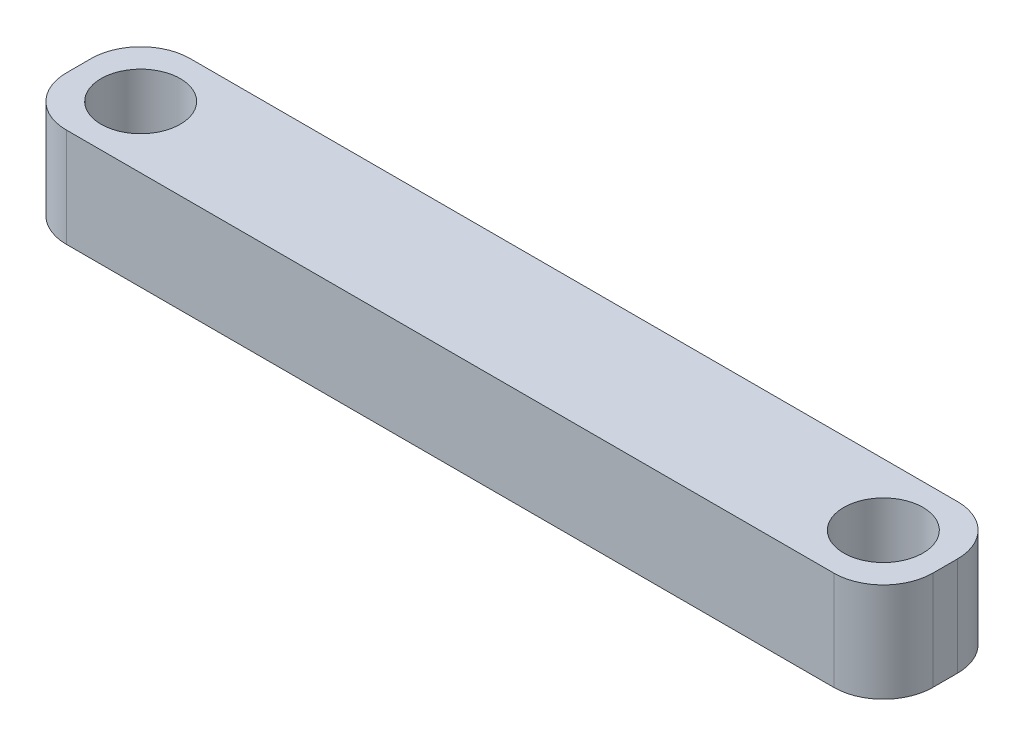
ISO-10303-21;
HEADER;
FILE_DESCRIPTION(('STEP AP214'),'2;1');
FILE_NAME('part.step','',(''),(''),'','','');
FILE_SCHEMA(('AUTOMOTIVE_DESIGN { 1 0 10303 214 1 1 1 1 }'));
ENDSEC;
DATA;
#1=APPLICATION_CONTEXT('core data for automotive mechanical design processes');
#2=APPLICATION_PROTOCOL_DEFINITION('international standard','automotive_design',2000,#1);
#3=PRODUCT_CONTEXT('',#1,'mechanical');
#4=PRODUCT('Part','Part','',(#3));
#5=PRODUCT_RELATED_PRODUCT_CATEGORY('part','',(#4));
#6=PRODUCT_DEFINITION_FORMATION('','',#4);
#7=PRODUCT_DEFINITION_CONTEXT('part definition',#1,'design');
#8=PRODUCT_DEFINITION('design','',#6,#7);
#9=PRODUCT_DEFINITION_SHAPE('','',#8);
#10=(LENGTH_UNIT() NAMED_UNIT(*) SI_UNIT(.MILLI.,.METRE.));
#11=(NAMED_UNIT(*) PLANE_ANGLE_UNIT() SI_UNIT($,.RADIAN.));
#12=(NAMED_UNIT(*) SI_UNIT($,.STERADIAN.) SOLID_ANGLE_UNIT());
#13=UNCERTAINTY_MEASURE_WITH_UNIT(LENGTH_MEASURE(1.E-05),#10,'distance_accuracy_value','');
#14=(GEOMETRIC_REPRESENTATION_CONTEXT(3) GLOBAL_UNCERTAINTY_ASSIGNED_CONTEXT((#13)) GLOBAL_UNIT_ASSIGNED_CONTEXT((#10,
#11,#12)) REPRESENTATION_CONTEXT('',''));
#15=CARTESIAN_POINT('',(0.,0.,0.));
#16=DIRECTION('',(0.,0.,1.));
#17=DIRECTION('',(1.,0.,0.));
#18=AXIS2_PLACEMENT_3D('',#15,#16,#17);
#19=CARTESIAN_POINT('',(0.,4.,0.));
#20=DIRECTION('',(0.,1.,0.));
#21=DIRECTION('',(0.,0.,1.));
#22=AXIS2_PLACEMENT_3D('',#19,#20,#21);
#23=PLANE('',#22);
#24=CARTESIAN_POINT('',(-15.,4.,0.));
#25=DIRECTION('',(0.,1.,0.));
#26=DIRECTION('',(0.,0.,1.));
#27=AXIS2_PLACEMENT_3D('',#24,#25,#26);
#28=CIRCLE('',#27,1.6);
#29=CARTESIAN_POINT('',(-15.,4.,1.6));
#30=VERTEX_POINT('',#29);
#31=EDGE_CURVE('E133',#30,#30,#28,.T.);
#32=ORIENTED_EDGE('',*,*,#31,.F.);
#33=EDGE_LOOP('',(#32));
#34=FACE_BOUND('',#33,.T.);
#35=DIRECTION('',(1.,0.,0.));
#36=VECTOR('',#35,1.);
#37=CARTESIAN_POINT('',(-17.5,4.,2.5));
#38=LINE('',#37,#36);
#39=CARTESIAN_POINT('',(-15.5,4.,2.5));
#40=VERTEX_POINT('',#39);
#41=CARTESIAN_POINT('',(15.5,4.,2.5));
#42=VERTEX_POINT('',#41);
#43=EDGE_CURVE('E142',#40,#42,#38,.T.);
#44=ORIENTED_EDGE('',*,*,#43,.T.);
#45=CARTESIAN_POINT('',(15.5,4.,0.5));
#46=DIRECTION('',(0.,1.,0.));
#47=DIRECTION('',(0.,0.,1.));
#48=AXIS2_PLACEMENT_3D('',#45,#46,#47);
#49=CIRCLE('',#48,2.);
#50=CARTESIAN_POINT('',(17.5,4.,0.5));
#51=VERTEX_POINT('',#50);
#52=EDGE_CURVE('E161',#42,#51,#49,.T.);
#53=ORIENTED_EDGE('',*,*,#52,.T.);
#54=DIRECTION('',(0.,0.,-1.));
#55=VECTOR('',#54,1.);
#56=CARTESIAN_POINT('',(17.5,4.,-2.5));
#57=LINE('',#56,#55);
#58=CARTESIAN_POINT('',(17.5,4.,-0.5));
#59=VERTEX_POINT('',#58);
#60=EDGE_CURVE('E125',#51,#59,#57,.T.);
#61=ORIENTED_EDGE('',*,*,#60,.T.);
#62=CARTESIAN_POINT('',(15.5,4.,-0.5));
#63=DIRECTION('',(0.,1.,0.));
#64=DIRECTION('',(0.,0.,1.));
#65=AXIS2_PLACEMENT_3D('',#62,#63,#64);
#66=CIRCLE('',#65,2.);
#67=CARTESIAN_POINT('',(15.5,4.,-2.5));
#68=VERTEX_POINT('',#67);
#69=EDGE_CURVE('E159',#59,#68,#66,.T.);
#70=ORIENTED_EDGE('',*,*,#69,.T.);
#71=DIRECTION('',(-1.,0.,0.));
#72=VECTOR('',#71,1.);
#73=CARTESIAN_POINT('',(-17.5,4.,-2.5));
#74=LINE('',#73,#72);
#75=CARTESIAN_POINT('',(-15.5,4.,-2.5));
#76=VERTEX_POINT('',#75);
#77=EDGE_CURVE('E172',#68,#76,#74,.T.);
#78=ORIENTED_EDGE('',*,*,#77,.T.);
#79=CARTESIAN_POINT('',(-15.5,4.,-0.5));
#80=DIRECTION('',(0.,1.,0.));
#81=DIRECTION('',(0.,0.,1.));
#82=AXIS2_PLACEMENT_3D('',#79,#80,#81);
#83=CIRCLE('',#82,2.);
#84=CARTESIAN_POINT('',(-17.5,4.,-0.5));
#85=VERTEX_POINT('',#84);
#86=EDGE_CURVE('E60',#76,#85,#83,.T.);
#87=ORIENTED_EDGE('',*,*,#86,.T.);
#88=DIRECTION('',(0.,0.,1.));
#89=VECTOR('',#88,1.);
#90=CARTESIAN_POINT('',(-17.5,4.,-2.5));
#91=LINE('',#90,#89);
#92=CARTESIAN_POINT('',(-17.5,4.,0.5));
#93=VERTEX_POINT('',#92);
#94=EDGE_CURVE('E180',#85,#93,#91,.T.);
#95=ORIENTED_EDGE('',*,*,#94,.T.);
#96=CARTESIAN_POINT('',(-15.5,4.,0.5));
#97=DIRECTION('',(0.,1.,0.));
#98=DIRECTION('',(0.,0.,1.));
#99=AXIS2_PLACEMENT_3D('',#96,#97,#98);
#100=CIRCLE('',#99,2.);
#101=EDGE_CURVE('E156',#93,#40,#100,.T.);
#102=ORIENTED_EDGE('',*,*,#101,.T.);
#103=EDGE_LOOP('',(#44,#53,#61,#70,#78,#87,#95,#102));
#104=FACE_BOUND('',#103,.T.);
#105=CARTESIAN_POINT('',(15.,4.,0.));
#106=DIRECTION('',(0.,1.,0.));
#107=DIRECTION('',(0.,0.,-1.));
#108=AXIS2_PLACEMENT_3D('',#105,#106,#107);
#109=CIRCLE('',#108,1.6);
#110=CARTESIAN_POINT('',(15.,4.,-1.6));
#111=VERTEX_POINT('',#110);
#112=EDGE_CURVE('E187',#111,#111,#109,.T.);
#113=ORIENTED_EDGE('',*,*,#112,.F.);
#114=EDGE_LOOP('',(#113));
#115=FACE_BOUND('',#114,.T.);
#116=ADVANCED_FACE('F39',(#34,#104,#115),#23,.T.);
#117=CARTESIAN_POINT('',(0.,0.,0.));
#118=DIRECTION('',(0.,1.,0.));
#119=DIRECTION('',(0.,0.,1.));
#120=AXIS2_PLACEMENT_3D('',#117,#118,#119);
#121=PLANE('',#120);
#122=DIRECTION('',(0.,0.,-1.));
#123=VECTOR('',#122,1.);
#124=CARTESIAN_POINT('',(17.5,0.,-2.5));
#125=LINE('',#124,#123);
#126=CARTESIAN_POINT('',(17.5,0.,0.5));
#127=VERTEX_POINT('',#126);
#128=CARTESIAN_POINT('',(17.5,0.,-0.5));
#129=VERTEX_POINT('',#128);
#130=EDGE_CURVE('E122',#127,#129,#125,.T.);
#131=ORIENTED_EDGE('',*,*,#130,.F.);
#132=CARTESIAN_POINT('',(15.5,0.,0.5));
#133=DIRECTION('',(0.,1.,0.));
#134=DIRECTION('',(0.,0.,1.));
#135=AXIS2_PLACEMENT_3D('',#132,#133,#134);
#136=CIRCLE('',#135,2.);
#137=CARTESIAN_POINT('',(15.5,0.,2.5));
#138=VERTEX_POINT('',#137);
#139=EDGE_CURVE('E105',#127,#138,#136,.F.);
#140=ORIENTED_EDGE('',*,*,#139,.T.);
#141=DIRECTION('',(1.,0.,0.));
#142=VECTOR('',#141,1.);
#143=CARTESIAN_POINT('',(-17.5,0.,2.5));
#144=LINE('',#143,#142);
#145=CARTESIAN_POINT('',(-15.5,0.,2.5));
#146=VERTEX_POINT('',#145);
#147=EDGE_CURVE('E146',#146,#138,#144,.T.);
#148=ORIENTED_EDGE('',*,*,#147,.F.);
#149=CARTESIAN_POINT('',(-15.5,0.,0.5));
#150=DIRECTION('',(0.,1.,0.));
#151=DIRECTION('',(0.,0.,1.));
#152=AXIS2_PLACEMENT_3D('',#149,#150,#151);
#153=CIRCLE('',#152,2.);
#154=CARTESIAN_POINT('',(-17.5,0.,0.5));
#155=VERTEX_POINT('',#154);
#156=EDGE_CURVE('E126',#146,#155,#153,.F.);
#157=ORIENTED_EDGE('',*,*,#156,.T.);
#158=DIRECTION('',(0.,0.,1.));
#159=VECTOR('',#158,1.);
#160=CARTESIAN_POINT('',(-17.5,0.,-2.5));
#161=LINE('',#160,#159);
#162=CARTESIAN_POINT('',(-17.5,0.,-0.5));
#163=VERTEX_POINT('',#162);
#164=EDGE_CURVE('E136',#163,#155,#161,.T.);
#165=ORIENTED_EDGE('',*,*,#164,.F.);
#166=CARTESIAN_POINT('',(-15.5,0.,-0.5));
#167=DIRECTION('',(0.,1.,0.));
#168=DIRECTION('',(0.,0.,1.));
#169=AXIS2_PLACEMENT_3D('',#166,#167,#168);
#170=CIRCLE('',#169,2.);
#171=CARTESIAN_POINT('',(-15.5,0.,-2.5));
#172=VERTEX_POINT('',#171);
#173=EDGE_CURVE('E150',#163,#172,#170,.F.);
#174=ORIENTED_EDGE('',*,*,#173,.T.);
#175=DIRECTION('',(-1.,0.,0.));
#176=VECTOR('',#175,1.);
#177=CARTESIAN_POINT('',(-17.5,0.,-2.5));
#178=LINE('',#177,#176);
#179=CARTESIAN_POINT('',(15.5,0.,-2.5));
#180=VERTEX_POINT('',#179);
#181=EDGE_CURVE('E132',#180,#172,#178,.T.);
#182=ORIENTED_EDGE('',*,*,#181,.F.);
#183=CARTESIAN_POINT('',(15.5,0.,-0.5));
#184=DIRECTION('',(0.,1.,0.));
#185=DIRECTION('',(0.,0.,1.));
#186=AXIS2_PLACEMENT_3D('',#183,#184,#185);
#187=CIRCLE('',#186,2.);
#188=EDGE_CURVE('E116',#180,#129,#187,.F.);
#189=ORIENTED_EDGE('',*,*,#188,.T.);
#190=EDGE_LOOP('',(#131,#140,#148,#157,#165,#174,#182,#189));
#191=FACE_BOUND('',#190,.T.);
#192=CARTESIAN_POINT('',(-15.,0.,0.));
#193=DIRECTION('',(0.,1.,0.));
#194=DIRECTION('',(0.,0.,1.));
#195=AXIS2_PLACEMENT_3D('',#192,#193,#194);
#196=CIRCLE('',#195,1.6);
#197=CARTESIAN_POINT('',(-15.,0.,1.6));
#198=VERTEX_POINT('',#197);
#199=EDGE_CURVE('E139',#198,#198,#196,.T.);
#200=ORIENTED_EDGE('',*,*,#199,.T.);
#201=EDGE_LOOP('',(#200));
#202=FACE_BOUND('',#201,.T.);
#203=CARTESIAN_POINT('',(15.,0.,0.));
#204=DIRECTION('',(0.,1.,0.));
#205=DIRECTION('',(0.,0.,-1.));
#206=AXIS2_PLACEMENT_3D('',#203,#204,#205);
#207=CIRCLE('',#206,1.6);
#208=CARTESIAN_POINT('',(15.,0.,-1.6));
#209=VERTEX_POINT('',#208);
#210=EDGE_CURVE('E189',#209,#209,#207,.T.);
#211=ORIENTED_EDGE('',*,*,#210,.T.);
#212=EDGE_LOOP('',(#211));
#213=FACE_BOUND('',#212,.T.);
#214=ADVANCED_FACE('F129',(#191,#202,#213),#121,.F.);
#215=CARTESIAN_POINT('',(17.5,4.,-2.5));
#216=DIRECTION('',(-1.,0.,0.));
#217=DIRECTION('',(0.,0.,1.));
#218=AXIS2_PLACEMENT_3D('',#215,#216,#217);
#219=PLANE('',#218);
#220=ORIENTED_EDGE('',*,*,#60,.F.);
#221=DIRECTION('',(0.,-1.,0.));
#222=VECTOR('',#221,1.);
#223=CARTESIAN_POINT('',(17.5,4.,0.5));
#224=LINE('',#223,#222);
#225=EDGE_CURVE('E109',#51,#127,#224,.T.);
#226=ORIENTED_EDGE('',*,*,#225,.T.);
#227=ORIENTED_EDGE('',*,*,#130,.T.);
#228=DIRECTION('',(0.,-1.,0.));
#229=VECTOR('',#228,1.);
#230=CARTESIAN_POINT('',(17.5,4.,-0.5));
#231=LINE('',#230,#229);
#232=EDGE_CURVE('E127',#129,#59,#231,.F.);
#233=ORIENTED_EDGE('',*,*,#232,.T.);
#234=EDGE_LOOP('',(#220,#226,#227,#233));
#235=FACE_BOUND('',#234,.T.);
#236=ADVANCED_FACE('F121',(#235),#219,.F.);
#237=CARTESIAN_POINT('',(-17.5,4.,-2.5));
#238=DIRECTION('',(0.,0.,1.));
#239=DIRECTION('',(1.,0.,0.));
#240=AXIS2_PLACEMENT_3D('',#237,#238,#239);
#241=PLANE('',#240);
#242=ORIENTED_EDGE('',*,*,#77,.F.);
#243=DIRECTION('',(0.,-1.,0.));
#244=VECTOR('',#243,1.);
#245=CARTESIAN_POINT('',(15.5,4.,-2.5));
#246=LINE('',#245,#244);
#247=EDGE_CURVE('E165',#68,#180,#246,.T.);
#248=ORIENTED_EDGE('',*,*,#247,.T.);
#249=ORIENTED_EDGE('',*,*,#181,.T.);
#250=DIRECTION('',(0.,-1.,0.));
#251=VECTOR('',#250,1.);
#252=CARTESIAN_POINT('',(-15.5,4.,-2.5));
#253=LINE('',#252,#251);
#254=EDGE_CURVE('E163',#172,#76,#253,.F.);
#255=ORIENTED_EDGE('',*,*,#254,.T.);
#256=EDGE_LOOP('',(#242,#248,#249,#255));
#257=FACE_BOUND('',#256,.T.);
#258=ADVANCED_FACE('F170',(#257),#241,.F.);
#259=CARTESIAN_POINT('',(-17.5,4.,-2.5));
#260=DIRECTION('',(1.,0.,0.));
#261=DIRECTION('',(0.,0.,-1.));
#262=AXIS2_PLACEMENT_3D('',#259,#260,#261);
#263=PLANE('',#262);
#264=ORIENTED_EDGE('',*,*,#94,.F.);
#265=DIRECTION('',(0.,-1.,0.));
#266=VECTOR('',#265,1.);
#267=CARTESIAN_POINT('',(-17.5,4.,-0.5));
#268=LINE('',#267,#266);
#269=EDGE_CURVE('E11',#85,#163,#268,.T.);
#270=ORIENTED_EDGE('',*,*,#269,.T.);
#271=ORIENTED_EDGE('',*,*,#164,.T.);
#272=DIRECTION('',(0.,-1.,0.));
#273=VECTOR('',#272,1.);
#274=CARTESIAN_POINT('',(-17.5,4.,0.5));
#275=LINE('',#274,#273);
#276=EDGE_CURVE('E47',#155,#93,#275,.F.);
#277=ORIENTED_EDGE('',*,*,#276,.T.);
#278=EDGE_LOOP('',(#264,#270,#271,#277));
#279=FACE_BOUND('',#278,.T.);
#280=ADVANCED_FACE('F179',(#279),#263,.F.);
#281=CARTESIAN_POINT('',(-17.5,4.,2.5));
#282=DIRECTION('',(0.,0.,-1.));
#283=DIRECTION('',(-1.,0.,0.));
#284=AXIS2_PLACEMENT_3D('',#281,#282,#283);
#285=PLANE('',#284);
#286=ORIENTED_EDGE('',*,*,#147,.T.);
#287=DIRECTION('',(0.,-1.,0.));
#288=VECTOR('',#287,1.);
#289=CARTESIAN_POINT('',(15.5,4.,2.5));
#290=LINE('',#289,#288);
#291=EDGE_CURVE('E110',#138,#42,#290,.F.);
#292=ORIENTED_EDGE('',*,*,#291,.T.);
#293=ORIENTED_EDGE('',*,*,#43,.F.);
#294=DIRECTION('',(0.,-1.,0.));
#295=VECTOR('',#294,1.);
#296=CARTESIAN_POINT('',(-15.5,4.,2.5));
#297=LINE('',#296,#295);
#298=EDGE_CURVE('E115',#40,#146,#297,.T.);
#299=ORIENTED_EDGE('',*,*,#298,.T.);
#300=EDGE_LOOP('',(#286,#292,#293,#299));
#301=FACE_BOUND('',#300,.T.);
#302=ADVANCED_FACE('F211',(#301),#285,.F.);
#303=CARTESIAN_POINT('',(-15.,4.,0.));
#304=DIRECTION('',(0.,-1.,0.));
#305=DIRECTION('',(0.,0.,-1.));
#306=AXIS2_PLACEMENT_3D('',#303,#304,#305);
#307=CYLINDRICAL_SURFACE('',#306,1.6);
#308=ORIENTED_EDGE('',*,*,#31,.T.);
#309=EDGE_LOOP('',(#308));
#310=FACE_BOUND('',#309,.T.);
#311=ORIENTED_EDGE('',*,*,#199,.F.);
#312=EDGE_LOOP('',(#311));
#313=FACE_BOUND('',#312,.T.);
#314=ADVANCED_FACE('F208',(#310,#313),#307,.F.);
#315=CARTESIAN_POINT('',(15.,4.,0.));
#316=DIRECTION('',(0.,-1.,0.));
#317=DIRECTION('',(0.,0.,-1.));
#318=AXIS2_PLACEMENT_3D('',#315,#316,#317);
#319=CYLINDRICAL_SURFACE('',#318,1.6);
#320=ORIENTED_EDGE('',*,*,#112,.T.);
#321=EDGE_LOOP('',(#320));
#322=FACE_BOUND('',#321,.T.);
#323=ORIENTED_EDGE('',*,*,#210,.F.);
#324=EDGE_LOOP('',(#323));
#325=FACE_BOUND('',#324,.T.);
#326=ADVANCED_FACE('F195',(#322,#325),#319,.F.);
#327=CARTESIAN_POINT('',(15.5,4.,0.5));
#328=DIRECTION('',(0.,-1.,0.));
#329=DIRECTION('',(0.,0.,-1.));
#330=AXIS2_PLACEMENT_3D('',#327,#328,#329);
#331=CYLINDRICAL_SURFACE('',#330,2.);
#332=ORIENTED_EDGE('',*,*,#52,.F.);
#333=ORIENTED_EDGE('',*,*,#291,.F.);
#334=ORIENTED_EDGE('',*,*,#139,.F.);
#335=ORIENTED_EDGE('',*,*,#225,.F.);
#336=EDGE_LOOP('',(#332,#333,#334,#335));
#337=FACE_BOUND('',#336,.T.);
#338=ADVANCED_FACE('F108',(#337),#331,.T.);
#339=CARTESIAN_POINT('',(15.5,4.,-0.5));
#340=DIRECTION('',(0.,-1.,0.));
#341=DIRECTION('',(0.,0.,-1.));
#342=AXIS2_PLACEMENT_3D('',#339,#340,#341);
#343=CYLINDRICAL_SURFACE('',#342,2.);
#344=ORIENTED_EDGE('',*,*,#69,.F.);
#345=ORIENTED_EDGE('',*,*,#232,.F.);
#346=ORIENTED_EDGE('',*,*,#188,.F.);
#347=ORIENTED_EDGE('',*,*,#247,.F.);
#348=EDGE_LOOP('',(#344,#345,#346,#347));
#349=FACE_BOUND('',#348,.T.);
#350=ADVANCED_FACE('F223',(#349),#343,.T.);
#351=CARTESIAN_POINT('',(-15.5,4.,-0.5));
#352=DIRECTION('',(0.,-1.,0.));
#353=DIRECTION('',(0.,0.,-1.));
#354=AXIS2_PLACEMENT_3D('',#351,#352,#353);
#355=CYLINDRICAL_SURFACE('',#354,2.);
#356=ORIENTED_EDGE('',*,*,#86,.F.);
#357=ORIENTED_EDGE('',*,*,#254,.F.);
#358=ORIENTED_EDGE('',*,*,#173,.F.);
#359=ORIENTED_EDGE('',*,*,#269,.F.);
#360=EDGE_LOOP('',(#356,#357,#358,#359));
#361=FACE_BOUND('',#360,.T.);
#362=ADVANCED_FACE('F178',(#361),#355,.T.);
#363=CARTESIAN_POINT('',(-15.5,4.,0.5));
#364=DIRECTION('',(0.,-1.,0.));
#365=DIRECTION('',(0.,0.,-1.));
#366=AXIS2_PLACEMENT_3D('',#363,#364,#365);
#367=CYLINDRICAL_SURFACE('',#366,2.);
#368=ORIENTED_EDGE('',*,*,#101,.F.);
#369=ORIENTED_EDGE('',*,*,#276,.F.);
#370=ORIENTED_EDGE('',*,*,#156,.F.);
#371=ORIENTED_EDGE('',*,*,#298,.F.);
#372=EDGE_LOOP('',(#368,#369,#370,#371));
#373=FACE_BOUND('',#372,.T.);
#374=ADVANCED_FACE('F41',(#373),#367,.T.);
#375=CLOSED_SHELL('',(#116,#214,#236,#258,#280,#302,#314,#326,#338,#350,#362,#374));
#376=MANIFOLD_SOLID_BREP('B2',#375);
#377=ADVANCED_BREP_SHAPE_REPRESENTATION('',(#18,#376),#14);
#378=SHAPE_DEFINITION_REPRESENTATION(#9,#377);
ENDSEC;
END-ISO-10303-21;
